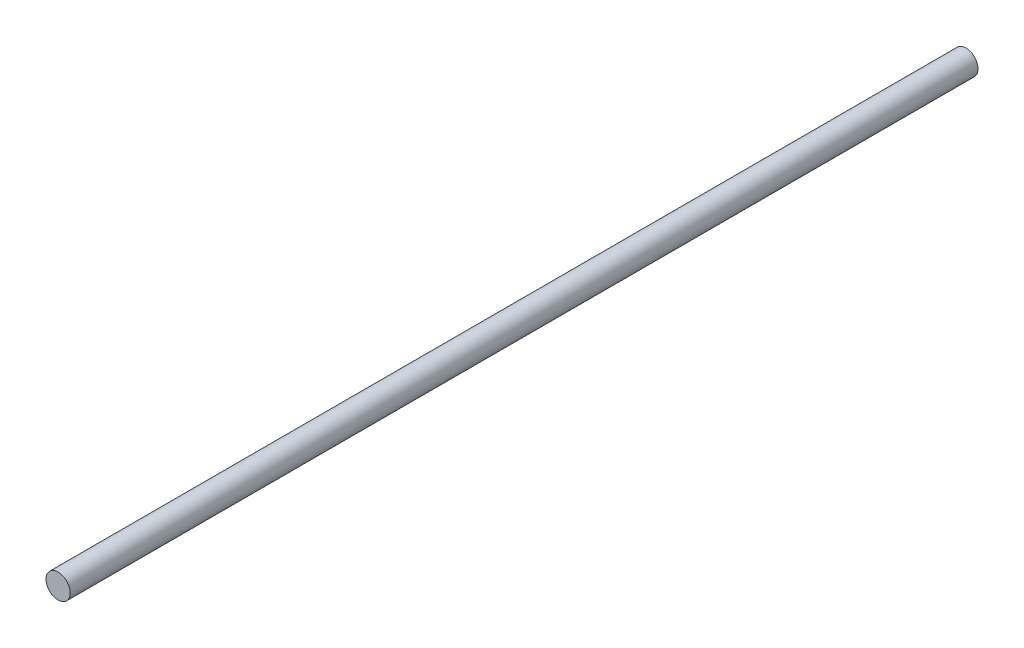
ISO-10303-21;
HEADER;
FILE_DESCRIPTION(('STEP AP214'),'2;1');
FILE_NAME('part.step','',(''),(''),'','','');
FILE_SCHEMA(('AUTOMOTIVE_DESIGN { 1 0 10303 214 1 1 1 1 }'));
ENDSEC;
DATA;
#1=APPLICATION_CONTEXT('core data for automotive mechanical design processes');
#2=APPLICATION_PROTOCOL_DEFINITION('international standard','automotive_design',2000,#1);
#3=PRODUCT_CONTEXT('',#1,'mechanical');
#4=PRODUCT('Part','Part','',(#3));
#5=PRODUCT_RELATED_PRODUCT_CATEGORY('part','',(#4));
#6=PRODUCT_DEFINITION_FORMATION('','',#4);
#7=PRODUCT_DEFINITION_CONTEXT('part definition',#1,'design');
#8=PRODUCT_DEFINITION('design','',#6,#7);
#9=PRODUCT_DEFINITION_SHAPE('','',#8);
#10=(LENGTH_UNIT() NAMED_UNIT(*) SI_UNIT(.MILLI.,.METRE.));
#11=(NAMED_UNIT(*) PLANE_ANGLE_UNIT() SI_UNIT($,.RADIAN.));
#12=(NAMED_UNIT(*) SI_UNIT($,.STERADIAN.) SOLID_ANGLE_UNIT());
#13=UNCERTAINTY_MEASURE_WITH_UNIT(LENGTH_MEASURE(1.E-05),#10,'distance_accuracy_value','');
#14=(GEOMETRIC_REPRESENTATION_CONTEXT(3) GLOBAL_UNCERTAINTY_ASSIGNED_CONTEXT((#13)) GLOBAL_UNIT_ASSIGNED_CONTEXT((#10,
#11,#12)) REPRESENTATION_CONTEXT('',''));
#15=CARTESIAN_POINT('',(0.,0.,0.));
#16=DIRECTION('',(0.,0.,1.));
#17=DIRECTION('',(1.,0.,0.));
#18=AXIS2_PLACEMENT_3D('',#15,#16,#17);
#19=CARTESIAN_POINT('',(0.,0.,75.));
#20=DIRECTION('',(0.,0.,-1.));
#21=DIRECTION('',(-1.,0.,0.));
#22=AXIS2_PLACEMENT_3D('',#19,#20,#21);
#23=CYLINDRICAL_SURFACE('',#22,1.);
#24=CARTESIAN_POINT('',(0.,0.,75.));
#25=DIRECTION('',(0.,0.,1.));
#26=DIRECTION('',(1.,0.,0.));
#27=AXIS2_PLACEMENT_3D('',#24,#25,#26);
#28=CIRCLE('',#27,1.);
#29=CARTESIAN_POINT('',(1.,0.,75.));
#30=VERTEX_POINT('',#29);
#31=EDGE_CURVE('E10',#30,#30,#28,.T.);
#32=ORIENTED_EDGE('',*,*,#31,.F.);
#33=EDGE_LOOP('',(#32));
#34=FACE_BOUND('',#33,.T.);
#35=CARTESIAN_POINT('',(0.,0.,0.));
#36=DIRECTION('',(0.,0.,1.));
#37=DIRECTION('',(1.,0.,0.));
#38=AXIS2_PLACEMENT_3D('',#35,#36,#37);
#39=CIRCLE('',#38,1.);
#40=CARTESIAN_POINT('',(1.,0.,0.));
#41=VERTEX_POINT('',#40);
#42=EDGE_CURVE('E38',#41,#41,#39,.T.);
#43=ORIENTED_EDGE('',*,*,#42,.T.);
#44=EDGE_LOOP('',(#43));
#45=FACE_BOUND('',#44,.T.);
#46=ADVANCED_FACE('F35',(#34,#45),#23,.T.);
#47=CARTESIAN_POINT('',(0.,0.,75.));
#48=DIRECTION('',(0.,0.,1.));
#49=DIRECTION('',(1.,0.,0.));
#50=AXIS2_PLACEMENT_3D('',#47,#48,#49);
#51=PLANE('',#50);
#52=ORIENTED_EDGE('',*,*,#31,.T.);
#53=EDGE_LOOP('',(#52));
#54=FACE_BOUND('',#53,.T.);
#55=ADVANCED_FACE('F50',(#54),#51,.T.);
#56=CARTESIAN_POINT('',(0.,0.,0.));
#57=DIRECTION('',(0.,0.,1.));
#58=DIRECTION('',(1.,0.,0.));
#59=AXIS2_PLACEMENT_3D('',#56,#57,#58);
#60=PLANE('',#59);
#61=ORIENTED_EDGE('',*,*,#42,.F.);
#62=EDGE_LOOP('',(#61));
#63=FACE_BOUND('',#62,.T.);
#64=ADVANCED_FACE('F48',(#63),#60,.F.);
#65=CLOSED_SHELL('',(#46,#55,#64));
#66=MANIFOLD_SOLID_BREP('B2',#65);
#67=ADVANCED_BREP_SHAPE_REPRESENTATION('',(#18,#66),#14);
#68=SHAPE_DEFINITION_REPRESENTATION(#9,#67);
ENDSEC;
END-ISO-10303-21;
